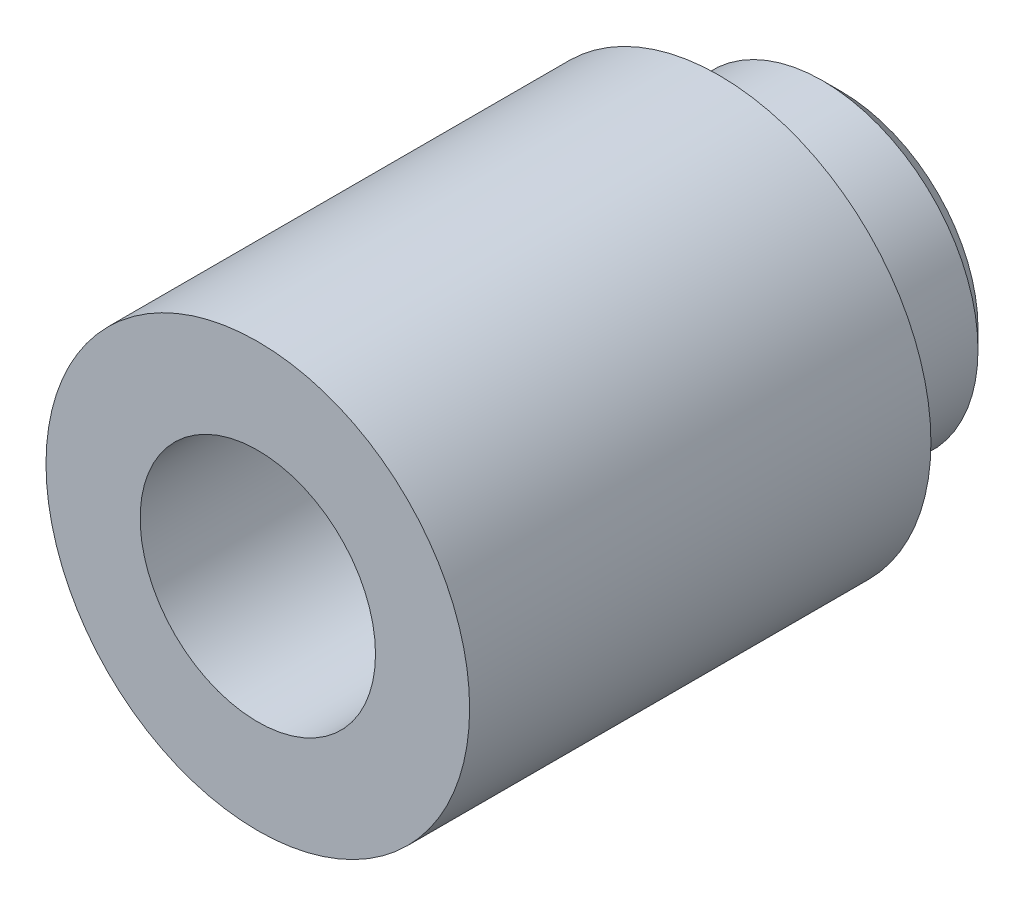
ISO-10303-21;
HEADER;
FILE_DESCRIPTION(('STEP AP214'),'2;1');
FILE_NAME('part.step','',(''),(''),'','','');
FILE_SCHEMA(('AUTOMOTIVE_DESIGN { 1 0 10303 214 1 1 1 1 }'));
ENDSEC;
DATA;
#1=APPLICATION_CONTEXT('core data for automotive mechanical design processes');
#2=APPLICATION_PROTOCOL_DEFINITION('international standard','automotive_design',2000,#1);
#3=PRODUCT_CONTEXT('',#1,'mechanical');
#4=PRODUCT('Part','Part','',(#3));
#5=PRODUCT_RELATED_PRODUCT_CATEGORY('part','',(#4));
#6=PRODUCT_DEFINITION_FORMATION('','',#4);
#7=PRODUCT_DEFINITION_CONTEXT('part definition',#1,'design');
#8=PRODUCT_DEFINITION('design','',#6,#7);
#9=PRODUCT_DEFINITION_SHAPE('','',#8);
#10=(LENGTH_UNIT() NAMED_UNIT(*) SI_UNIT(.MILLI.,.METRE.));
#11=(NAMED_UNIT(*) PLANE_ANGLE_UNIT() SI_UNIT($,.RADIAN.));
#12=(NAMED_UNIT(*) SI_UNIT($,.STERADIAN.) SOLID_ANGLE_UNIT());
#13=UNCERTAINTY_MEASURE_WITH_UNIT(LENGTH_MEASURE(1.E-05),#10,'distance_accuracy_value','');
#14=(GEOMETRIC_REPRESENTATION_CONTEXT(3) GLOBAL_UNCERTAINTY_ASSIGNED_CONTEXT((#13)) GLOBAL_UNIT_ASSIGNED_CONTEXT((#10,
#11,#12)) REPRESENTATION_CONTEXT('',''));
#15=CARTESIAN_POINT('',(0.,0.,0.));
#16=DIRECTION('',(0.,0.,1.));
#17=DIRECTION('',(1.,0.,0.));
#18=AXIS2_PLACEMENT_3D('',#15,#16,#17);
#19=CARTESIAN_POINT('',(0.,0.,-6.2));
#20=DIRECTION('',(0.,0.,1.));
#21=DIRECTION('',(1.,0.,0.));
#22=AXIS2_PLACEMENT_3D('',#19,#20,#21);
#23=CYLINDRICAL_SURFACE('',#22,2.25);
#24=CARTESIAN_POINT('',(0.,0.,0.));
#25=DIRECTION('',(0.,0.,1.));
#26=DIRECTION('',(1.,0.,0.));
#27=AXIS2_PLACEMENT_3D('',#24,#25,#26);
#28=CIRCLE('',#27,2.25);
#29=CARTESIAN_POINT('',(2.25,0.,0.));
#30=VERTEX_POINT('',#29);
#31=EDGE_CURVE('E44',#30,#30,#28,.T.);
#32=CARTESIAN_POINT('',(0.,0.,-4.9));
#33=DIRECTION('',(0.,0.,-1.));
#34=DIRECTION('',(-1.,0.,0.));
#35=AXIS2_PLACEMENT_3D('',#32,#33,#34);
#36=CIRCLE('',#35,2.25);
#37=CARTESIAN_POINT('',(2.25,0.,-4.9));
#38=VERTEX_POINT('',#37);
#39=EDGE_CURVE('E48',#38,#38,#36,.F.);
#40=CARTESIAN_POINT('',(2.25,0.,0.));
#41=CARTESIAN_POINT('',(2.25,0.,-0.0510416666666665));
#42=CARTESIAN_POINT('',(2.25,0.,-0.102083333333333));
#43=CARTESIAN_POINT('',(2.25,0.,-0.204166666666666));
#44=CARTESIAN_POINT('',(2.25,0.,-0.255208333333333));
#45=CARTESIAN_POINT('',(2.25,0.,-0.357291666666667));
#46=CARTESIAN_POINT('',(2.25,0.,-0.408333333333333));
#47=CARTESIAN_POINT('',(2.25,0.,-0.510416666666667));
#48=CARTESIAN_POINT('',(2.25,0.,-0.561458333333333));
#49=CARTESIAN_POINT('',(2.25,0.,-0.663541666666667));
#50=CARTESIAN_POINT('',(2.25,0.,-0.714583333333333));
#51=CARTESIAN_POINT('',(2.25,0.,-0.816666666666667));
#52=CARTESIAN_POINT('',(2.25,0.,-0.867708333333334));
#53=CARTESIAN_POINT('',(2.25,0.,-0.969791666666667));
#54=CARTESIAN_POINT('',(2.25,0.,-1.02083333333333));
#55=CARTESIAN_POINT('',(2.25,0.,-1.12291666666667));
#56=CARTESIAN_POINT('',(2.25,0.,-1.17395833333333));
#57=CARTESIAN_POINT('',(2.25,0.,-1.27604166666667));
#58=CARTESIAN_POINT('',(2.25,0.,-1.32708333333333));
#59=CARTESIAN_POINT('',(2.25,0.,-1.42916666666667));
#60=CARTESIAN_POINT('',(2.25,0.,-1.48020833333333));
#61=CARTESIAN_POINT('',(2.25,0.,-1.58229166666667));
#62=CARTESIAN_POINT('',(2.25,0.,-1.63333333333333));
#63=CARTESIAN_POINT('',(2.25,0.,-1.73541666666667));
#64=CARTESIAN_POINT('',(2.25,0.,-1.78645833333333));
#65=CARTESIAN_POINT('',(2.25,0.,-1.88854166666667));
#66=CARTESIAN_POINT('',(2.25,0.,-1.93958333333333));
#67=CARTESIAN_POINT('',(2.25,0.,-2.04166666666667));
#68=CARTESIAN_POINT('',(2.25,0.,-2.09270833333333));
#69=CARTESIAN_POINT('',(2.25,0.,-2.19479166666667));
#70=CARTESIAN_POINT('',(2.25,0.,-2.24583333333333));
#71=CARTESIAN_POINT('',(2.25,0.,-2.34791666666667));
#72=CARTESIAN_POINT('',(2.25,0.,-2.39895833333333));
#73=CARTESIAN_POINT('',(2.25,0.,-2.50104166666667));
#74=CARTESIAN_POINT('',(2.25,0.,-2.55208333333333));
#75=CARTESIAN_POINT('',(2.25,0.,-2.65416666666667));
#76=CARTESIAN_POINT('',(2.25,0.,-2.70520833333333));
#77=CARTESIAN_POINT('',(2.25,0.,-2.80729166666667));
#78=CARTESIAN_POINT('',(2.25,0.,-2.85833333333333));
#79=CARTESIAN_POINT('',(2.25,0.,-2.96041666666667));
#80=CARTESIAN_POINT('',(2.25,0.,-3.01145833333333));
#81=CARTESIAN_POINT('',(2.25,0.,-3.11354166666667));
#82=CARTESIAN_POINT('',(2.25,0.,-3.16458333333333));
#83=CARTESIAN_POINT('',(2.25,0.,-3.26666666666667));
#84=CARTESIAN_POINT('',(2.25,0.,-3.31770833333333));
#85=CARTESIAN_POINT('',(2.25,0.,-3.41979166666667));
#86=CARTESIAN_POINT('',(2.25,0.,-3.47083333333333));
#87=CARTESIAN_POINT('',(2.25,0.,-3.57291666666667));
#88=CARTESIAN_POINT('',(2.25,0.,-3.62395833333333));
#89=CARTESIAN_POINT('',(2.25,0.,-3.72604166666667));
#90=CARTESIAN_POINT('',(2.25,0.,-3.77708333333333));
#91=CARTESIAN_POINT('',(2.25,0.,-3.87916666666667));
#92=CARTESIAN_POINT('',(2.25,0.,-3.93020833333333));
#93=CARTESIAN_POINT('',(2.25,0.,-4.03229166666667));
#94=CARTESIAN_POINT('',(2.25,0.,-4.08333333333333));
#95=CARTESIAN_POINT('',(2.25,0.,-4.18541666666667));
#96=CARTESIAN_POINT('',(2.25,0.,-4.23645833333333));
#97=CARTESIAN_POINT('',(2.25,0.,-4.33854166666667));
#98=CARTESIAN_POINT('',(2.25,0.,-4.38958333333333));
#99=CARTESIAN_POINT('',(2.25,0.,-4.49166666666667));
#100=CARTESIAN_POINT('',(2.25,0.,-4.54270833333333));
#101=CARTESIAN_POINT('',(2.25,0.,-4.64479166666667));
#102=CARTESIAN_POINT('',(2.25,0.,-4.69583333333333));
#103=CARTESIAN_POINT('',(2.25,0.,-4.79791666666667));
#104=CARTESIAN_POINT('',(2.25,0.,-4.84895833333333));
#105=CARTESIAN_POINT('',(2.25,0.,-4.9));
#106=B_SPLINE_CURVE_WITH_KNOTS('',3,(#40,#41,#42,#43,#44,#45,#46,#47,#48,#49,#50,#51,#52,#53,
#54,#55,#56,#57,#58,#59,#60,#61,#62,#63,#64,#65,#66,#67,#68,#69,#70,#71,#72,#73,#74,#75,#76,#77,
#78,#79,#80,#81,#82,#83,#84,#85,#86,#87,#88,#89,#90,#91,#92,#93,#94,#95,#96,#97,#98,#99,#100,
#101,#102,#103,#104,#105),.UNSPECIFIED.,.F.,.F.,(4,2,2,2,2,2,2,2,2,2,2,2,2,2,2,2,2,2,2,2,2,2,2,
2,2,2,2,2,2,2,2,2,4),(0.,0.153125,0.30625,0.459375,0.6125,0.765625,0.91875,1.071875,1.225,
1.378125,1.53125,1.684375,1.8375,1.990625,2.14375,2.296875,2.45,2.603125,2.75625,2.909375,
3.0625,3.215625,3.36875,3.521875,3.675,3.828125,3.98125,4.134375,4.2875,4.440625,4.59375,
4.746875,4.9),.UNSPECIFIED.);
#107=EDGE_CURVE('BSEAM33',#30,#38,#106,.T.);
#108=ORIENTED_EDGE('',*,*,#31,.F.);
#109=ORIENTED_EDGE('',*,*,#39,.T.);
#110=ORIENTED_EDGE('',*,*,#107,.T.);
#111=ORIENTED_EDGE('',*,*,#107,.F.);
#112=EDGE_LOOP('',(#108,#110,#109,#111));
#113=FACE_BOUND('',#112,.T.);
#114=ADVANCED_FACE('F33',(#113),#23,.T.);
#115=CARTESIAN_POINT('',(0.,0.,0.));
#116=DIRECTION('',(0.,0.,1.));
#117=DIRECTION('',(1.,0.,0.));
#118=AXIS2_PLACEMENT_3D('',#115,#116,#117);
#119=PLANE('',#118);
#120=CARTESIAN_POINT('',(0.,0.,0.));
#121=DIRECTION('',(0.,0.,1.));
#122=DIRECTION('',(1.,0.,0.));
#123=AXIS2_PLACEMENT_3D('',#120,#121,#122);
#124=CIRCLE('',#123,1.25);
#125=CARTESIAN_POINT('',(1.25,0.,0.));
#126=VERTEX_POINT('',#125);
#127=EDGE_CURVE('E57',#126,#126,#124,.T.);
#128=ORIENTED_EDGE('',*,*,#127,.F.);
#129=EDGE_LOOP('',(#128));
#130=FACE_BOUND('',#129,.T.);
#131=ORIENTED_EDGE('',*,*,#31,.T.);
#132=EDGE_LOOP('',(#131));
#133=FACE_BOUND('',#132,.T.);
#134=ADVANCED_FACE('F71',(#130,#133),#119,.T.);
#135=CARTESIAN_POINT('',(0.,0.,-4.9));
#136=DIRECTION('',(0.,0.,-1.));
#137=DIRECTION('',(-1.,0.,0.));
#138=AXIS2_PLACEMENT_3D('',#135,#136,#137);
#139=PLANE('',#138);
#140=ORIENTED_EDGE('',*,*,#39,.F.);
#141=EDGE_LOOP('',(#140));
#142=FACE_BOUND('',#141,.T.);
#143=CARTESIAN_POINT('',(0.,0.,-4.9));
#144=DIRECTION('',(0.,0.,-1.));
#145=DIRECTION('',(-1.,0.,0.));
#146=AXIS2_PLACEMENT_3D('',#143,#144,#145);
#147=CIRCLE('',#146,1.65);
#148=CARTESIAN_POINT('',(-1.65,0.,-4.9));
#149=VERTEX_POINT('',#148);
#150=EDGE_CURVE('E52',#149,#149,#147,.T.);
#151=ORIENTED_EDGE('',*,*,#150,.F.);
#152=EDGE_LOOP('',(#151));
#153=FACE_BOUND('',#152,.T.);
#154=ADVANCED_FACE('F74',(#142,#153),#139,.T.);
#155=CARTESIAN_POINT('',(0.,0.,-4.9));
#156=DIRECTION('',(0.,0.,-1.));
#157=DIRECTION('',(-1.,0.,0.));
#158=AXIS2_PLACEMENT_3D('',#155,#156,#157);
#159=CYLINDRICAL_SURFACE('',#158,1.65);
#160=CARTESIAN_POINT('',(0.,0.,-6.));
#161=DIRECTION('',(0.,0.,1.));
#162=DIRECTION('',(1.,0.,0.));
#163=AXIS2_PLACEMENT_3D('',#160,#161,#162);
#164=CIRCLE('',#163,1.65);
#165=CARTESIAN_POINT('',(1.65,0.,-6.));
#166=VERTEX_POINT('',#165);
#167=EDGE_CURVE('E11',#166,#166,#164,.T.);
#168=ORIENTED_EDGE('',*,*,#167,.T.);
#169=EDGE_LOOP('',(#168));
#170=FACE_BOUND('',#169,.T.);
#171=ORIENTED_EDGE('',*,*,#150,.T.);
#172=EDGE_LOOP('',(#171));
#173=FACE_BOUND('',#172,.T.);
#174=ADVANCED_FACE('F84',(#170,#173),#159,.T.);
#175=CARTESIAN_POINT('',(0.,0.,-6.2));
#176=DIRECTION('',(0.,0.,1.));
#177=DIRECTION('',(1.,0.,0.));
#178=AXIS2_PLACEMENT_3D('',#175,#176,#177);
#179=PLANE('',#178);
#180=CARTESIAN_POINT('',(0.,0.,-6.2));
#181=DIRECTION('',(0.,0.,1.));
#182=DIRECTION('',(1.,0.,0.));
#183=AXIS2_PLACEMENT_3D('',#180,#181,#182);
#184=CIRCLE('',#183,1.45);
#185=CARTESIAN_POINT('',(1.45,0.,-6.2));
#186=VERTEX_POINT('',#185);
#187=EDGE_CURVE('E40',#186,#186,#184,.F.);
#188=ORIENTED_EDGE('',*,*,#187,.T.);
#189=EDGE_LOOP('',(#188));
#190=FACE_BOUND('',#189,.T.);
#191=CARTESIAN_POINT('',(0.,0.,-6.2));
#192=DIRECTION('',(0.,0.,1.));
#193=DIRECTION('',(1.,0.,0.));
#194=AXIS2_PLACEMENT_3D('',#191,#192,#193);
#195=CIRCLE('',#194,1.25);
#196=CARTESIAN_POINT('',(1.25,0.,-6.2));
#197=VERTEX_POINT('',#196);
#198=EDGE_CURVE('E56',#197,#197,#195,.T.);
#199=ORIENTED_EDGE('',*,*,#198,.T.);
#200=EDGE_LOOP('',(#199));
#201=FACE_BOUND('',#200,.T.);
#202=ADVANCED_FACE('F63',(#190,#201),#179,.F.);
#203=CARTESIAN_POINT('',(0.,0.,-6.2));
#204=DIRECTION('',(0.,0.,1.));
#205=DIRECTION('',(1.,0.,0.));
#206=AXIS2_PLACEMENT_3D('',#203,#204,#205);
#207=CYLINDRICAL_SURFACE('',#206,1.25);
#208=CARTESIAN_POINT('',(1.25,0.,-6.2));
#209=CARTESIAN_POINT('',(1.25,0.,-6.13541666666667));
#210=CARTESIAN_POINT('',(1.25,0.,-6.07083333333333));
#211=CARTESIAN_POINT('',(1.25,0.,-5.94166666666667));
#212=CARTESIAN_POINT('',(1.25,0.,-5.87708333333333));
#213=CARTESIAN_POINT('',(1.25,0.,-5.74791666666667));
#214=CARTESIAN_POINT('',(1.25,0.,-5.68333333333333));
#215=CARTESIAN_POINT('',(1.25,0.,-5.55416666666667));
#216=CARTESIAN_POINT('',(1.25,0.,-5.48958333333333));
#217=CARTESIAN_POINT('',(1.25,0.,-5.36041666666667));
#218=CARTESIAN_POINT('',(1.25,0.,-5.29583333333333));
#219=CARTESIAN_POINT('',(1.25,0.,-5.16666666666667));
#220=CARTESIAN_POINT('',(1.25,0.,-5.10208333333333));
#221=CARTESIAN_POINT('',(1.25,0.,-4.97291666666667));
#222=CARTESIAN_POINT('',(1.25,0.,-4.90833333333333));
#223=CARTESIAN_POINT('',(1.25,0.,-4.77916666666667));
#224=CARTESIAN_POINT('',(1.25,0.,-4.71458333333333));
#225=CARTESIAN_POINT('',(1.25,0.,-4.58541666666667));
#226=CARTESIAN_POINT('',(1.25,0.,-4.52083333333333));
#227=CARTESIAN_POINT('',(1.25,0.,-4.39166666666667));
#228=CARTESIAN_POINT('',(1.25,0.,-4.32708333333333));
#229=CARTESIAN_POINT('',(1.25,0.,-4.19791666666667));
#230=CARTESIAN_POINT('',(1.25,0.,-4.13333333333333));
#231=CARTESIAN_POINT('',(1.25,0.,-4.00416666666667));
#232=CARTESIAN_POINT('',(1.25,0.,-3.93958333333333));
#233=CARTESIAN_POINT('',(1.25,0.,-3.81041666666667));
#234=CARTESIAN_POINT('',(1.25,0.,-3.74583333333333));
#235=CARTESIAN_POINT('',(1.25,0.,-3.61666666666667));
#236=CARTESIAN_POINT('',(1.25,0.,-3.55208333333333));
#237=CARTESIAN_POINT('',(1.25,0.,-3.42291666666667));
#238=CARTESIAN_POINT('',(1.25,0.,-3.35833333333333));
#239=CARTESIAN_POINT('',(1.25,0.,-3.22916666666667));
#240=CARTESIAN_POINT('',(1.25,0.,-3.16458333333333));
#241=CARTESIAN_POINT('',(1.25,0.,-3.03541666666667));
#242=CARTESIAN_POINT('',(1.25,0.,-2.97083333333333));
#243=CARTESIAN_POINT('',(1.25,0.,-2.84166666666667));
#244=CARTESIAN_POINT('',(1.25,0.,-2.77708333333333));
#245=CARTESIAN_POINT('',(1.25,0.,-2.64791666666667));
#246=CARTESIAN_POINT('',(1.25,0.,-2.58333333333333));
#247=CARTESIAN_POINT('',(1.25,0.,-2.45416666666667));
#248=CARTESIAN_POINT('',(1.25,0.,-2.38958333333333));
#249=CARTESIAN_POINT('',(1.25,0.,-2.26041666666667));
#250=CARTESIAN_POINT('',(1.25,0.,-2.19583333333333));
#251=CARTESIAN_POINT('',(1.25,0.,-2.06666666666667));
#252=CARTESIAN_POINT('',(1.25,0.,-2.00208333333333));
#253=CARTESIAN_POINT('',(1.25,0.,-1.87291666666667));
#254=CARTESIAN_POINT('',(1.25,0.,-1.80833333333333));
#255=CARTESIAN_POINT('',(1.25,0.,-1.67916666666667));
#256=CARTESIAN_POINT('',(1.25,0.,-1.61458333333333));
#257=CARTESIAN_POINT('',(1.25,0.,-1.48541666666667));
#258=CARTESIAN_POINT('',(1.25,0.,-1.42083333333333));
#259=CARTESIAN_POINT('',(1.25,0.,-1.29166666666667));
#260=CARTESIAN_POINT('',(1.25,0.,-1.22708333333333));
#261=CARTESIAN_POINT('',(1.25,0.,-1.09791666666667));
#262=CARTESIAN_POINT('',(1.25,0.,-1.03333333333333));
#263=CARTESIAN_POINT('',(1.25,0.,-0.904166666666667));
#264=CARTESIAN_POINT('',(1.25,0.,-0.839583333333333));
#265=CARTESIAN_POINT('',(1.25,0.,-0.710416666666666));
#266=CARTESIAN_POINT('',(1.25,0.,-0.645833333333333));
#267=CARTESIAN_POINT('',(1.25,0.,-0.516666666666667));
#268=CARTESIAN_POINT('',(1.25,0.,-0.452083333333333));
#269=CARTESIAN_POINT('',(1.25,0.,-0.322916666666667));
#270=CARTESIAN_POINT('',(1.25,0.,-0.258333333333334));
#271=CARTESIAN_POINT('',(1.25,0.,-0.129166666666667));
#272=CARTESIAN_POINT('',(1.25,0.,-0.0645833333333335));
#273=CARTESIAN_POINT('',(1.25,0.,0.));
#274=B_SPLINE_CURVE_WITH_KNOTS('',3,(#208,#209,#210,#211,#212,#213,#214,#215,#216,#217,#218,
#219,#220,#221,#222,#223,#224,#225,#226,#227,#228,#229,#230,#231,#232,#233,#234,#235,#236,#237,
#238,#239,#240,#241,#242,#243,#244,#245,#246,#247,#248,#249,#250,#251,#252,#253,#254,#255,#256,
#257,#258,#259,#260,#261,#262,#263,#264,#265,#266,#267,#268,#269,#270,#271,#272,#273),
.UNSPECIFIED.,.F.,.F.,(4,2,2,2,2,2,2,2,2,2,2,2,2,2,2,2,2,2,2,2,2,2,2,2,2,2,2,2,2,2,2,2,4),(0.,
0.193749999999999,0.3875,0.581249999999999,0.775,0.96875,1.1625,1.35625,1.55,1.74375,1.9375,
2.13125,2.325,2.51875,2.7125,2.90625,3.1,3.29375,3.4875,3.68125,3.875,4.06875,4.2625,4.45625,
4.65,4.84375,5.0375,5.23125,5.425,5.61875,5.8125,6.00625,6.2),.UNSPECIFIED.);
#275=EDGE_CURVE('BSEAM65',#197,#126,#274,.T.);
#276=ORIENTED_EDGE('',*,*,#198,.F.);
#277=ORIENTED_EDGE('',*,*,#127,.T.);
#278=ORIENTED_EDGE('',*,*,#275,.T.);
#279=ORIENTED_EDGE('',*,*,#275,.F.);
#280=EDGE_LOOP('',(#276,#278,#277,#279));
#281=FACE_BOUND('',#280,.T.);
#282=ADVANCED_FACE('F65',(#281),#207,.F.);
#283=CARTESIAN_POINT('',(0.,0.,-6.2));
#284=DIRECTION('',(0.,0.,1.));
#285=DIRECTION('',(1.,0.,0.));
#286=AXIS2_PLACEMENT_3D('',#283,#284,#285);
#287=CONICAL_SURFACE('',#286,1.45,0.785398163397445);
#288=ORIENTED_EDGE('',*,*,#167,.F.);
#289=EDGE_LOOP('',(#288));
#290=FACE_BOUND('',#289,.T.);
#291=ORIENTED_EDGE('',*,*,#187,.F.);
#292=EDGE_LOOP('',(#291));
#293=FACE_BOUND('',#292,.T.);
#294=ADVANCED_FACE('F35',(#290,#293),#287,.T.);
#295=CLOSED_SHELL('',(#114,#134,#154,#174,#202,#282,#294));
#296=MANIFOLD_SOLID_BREP('B2',#295);
#297=ADVANCED_BREP_SHAPE_REPRESENTATION('',(#18,#296),#14);
#298=SHAPE_DEFINITION_REPRESENTATION(#9,#297);
ENDSEC;
END-ISO-10303-21;
